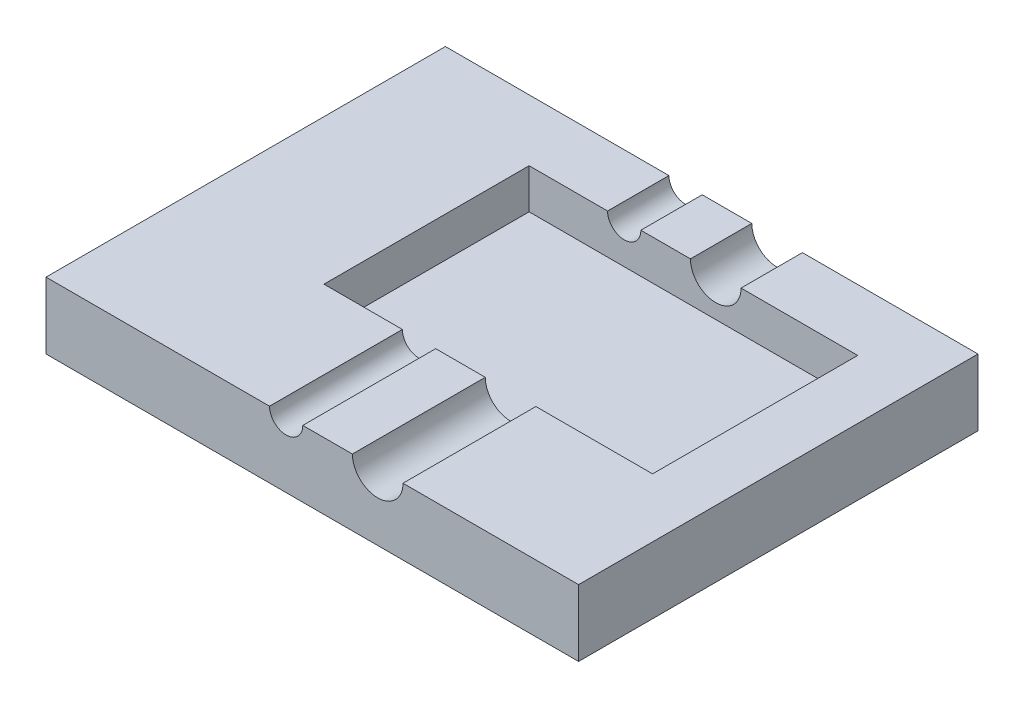
ISO-10303-21;
HEADER;
FILE_DESCRIPTION(('STEP AP214'),'2;1');
FILE_NAME('part.step','',(''),(''),'','','');
FILE_SCHEMA(('AUTOMOTIVE_DESIGN { 1 0 10303 214 1 1 1 1 }'));
ENDSEC;
DATA;
#1=APPLICATION_CONTEXT('core data for automotive mechanical design processes');
#2=APPLICATION_PROTOCOL_DEFINITION('international standard','automotive_design',2000,#1);
#3=PRODUCT_CONTEXT('',#1,'mechanical');
#4=PRODUCT('Part','Part','',(#3));
#5=PRODUCT_RELATED_PRODUCT_CATEGORY('part','',(#4));
#6=PRODUCT_DEFINITION_FORMATION('','',#4);
#7=PRODUCT_DEFINITION_CONTEXT('part definition',#1,'design');
#8=PRODUCT_DEFINITION('design','',#6,#7);
#9=PRODUCT_DEFINITION_SHAPE('','',#8);
#10=(LENGTH_UNIT() NAMED_UNIT(*) SI_UNIT(.MILLI.,.METRE.));
#11=(NAMED_UNIT(*) PLANE_ANGLE_UNIT() SI_UNIT($,.RADIAN.));
#12=(NAMED_UNIT(*) SI_UNIT($,.STERADIAN.) SOLID_ANGLE_UNIT());
#13=UNCERTAINTY_MEASURE_WITH_UNIT(LENGTH_MEASURE(1.E-05),#10,'distance_accuracy_value','');
#14=(GEOMETRIC_REPRESENTATION_CONTEXT(3) GLOBAL_UNCERTAINTY_ASSIGNED_CONTEXT((#13)) GLOBAL_UNIT_ASSIGNED_CONTEXT((#10,
#11,#12)) REPRESENTATION_CONTEXT('',''));
#15=CARTESIAN_POINT('',(0.,0.,0.));
#16=DIRECTION('',(0.,0.,1.));
#17=DIRECTION('',(1.,0.,0.));
#18=AXIS2_PLACEMENT_3D('',#15,#16,#17);
#19=CARTESIAN_POINT('',(0.,12.7,0.));
#20=DIRECTION('',(0.,-1.,0.));
#21=DIRECTION('',(0.,0.,-1.));
#22=AXIS2_PLACEMENT_3D('',#19,#20,#21);
#23=PLANE('',#22);
#24=DIRECTION('',(1.,0.,0.));
#25=VECTOR('',#24,1.);
#26=CARTESIAN_POINT('',(-23.1249939003562,12.7,-17.3143065832297));
#27=LINE('',#26,#25);
#28=CARTESIAN_POINT('',(-1.81162350851414,12.7,-17.3143065832297));
#29=VERTEX_POINT('',#28);
#30=CARTESIAN_POINT('',(7.64987649148585,12.7,-17.3143065832297));
#31=VERTEX_POINT('',#30);
#32=EDGE_CURVE('E226',#29,#31,#27,.T.);
#33=ORIENTED_EDGE('',*,*,#32,.F.);
#34=DIRECTION('',(0.,0.,1.));
#35=VECTOR('',#34,1.);
#36=CARTESIAN_POINT('',(-1.81162350851414,12.7,-68.1620253164557));
#37=LINE('',#36,#35);
#38=CARTESIAN_POINT('',(-1.81162350851414,12.7,8.03797468354433));
#39=VERTEX_POINT('',#38);
#40=EDGE_CURVE('E257',#29,#39,#37,.T.);
#41=ORIENTED_EDGE('',*,*,#40,.T.);
#42=DIRECTION('',(1.,0.,0.));
#43=VECTOR('',#42,1.);
#44=CARTESIAN_POINT('',(-50.8,12.7,8.03797468354433));
#45=LINE('',#44,#43);
#46=CARTESIAN_POINT('',(7.64987649148585,12.7,8.03797468354433));
#47=VERTEX_POINT('',#46);
#48=EDGE_CURVE('E354',#39,#47,#45,.T.);
#49=ORIENTED_EDGE('',*,*,#48,.T.);
#50=DIRECTION('',(0.,0.,1.));
#51=VECTOR('',#50,1.);
#52=CARTESIAN_POINT('',(7.64987649148585,12.7,-68.1620253164557));
#53=LINE('',#52,#51);
#54=EDGE_CURVE('E271',#47,#31,#53,.F.);
#55=ORIENTED_EDGE('',*,*,#54,.T.);
#56=EDGE_LOOP('',(#33,#41,#49,#55));
#57=FACE_BOUND('',#56,.T.);
#58=ADVANCED_FACE('F44',(#57),#23,.F.);
#59=DIRECTION('',(-1.,0.,0.));
#60=VECTOR('',#59,1.);
#61=CARTESIAN_POINT('',(-50.8,12.7,-68.1620253164557));
#62=LINE('',#61,#60);
#63=CARTESIAN_POINT('',(7.64987649148585,12.7,-68.1620253164557));
#64=VERTEX_POINT('',#63);
#65=CARTESIAN_POINT('',(-1.81162350851414,12.7,-68.1620253164557));
#66=VERTEX_POINT('',#65);
#67=EDGE_CURVE('E177',#64,#66,#62,.T.);
#68=ORIENTED_EDGE('',*,*,#67,.T.);
#69=CARTESIAN_POINT('',(-1.81162350851414,12.7,-56.452963685655));
#70=VERTEX_POINT('',#69);
#71=EDGE_CURVE('E245',#66,#70,#37,.T.);
#72=ORIENTED_EDGE('',*,*,#71,.T.);
#73=DIRECTION('',(1.,0.,0.));
#74=VECTOR('',#73,1.);
#75=CARTESIAN_POINT('',(-23.1249939003562,12.7,-56.452963685655));
#76=LINE('',#75,#74);
#77=CARTESIAN_POINT('',(7.64987649148585,12.7,-56.452963685655));
#78=VERTEX_POINT('',#77);
#79=EDGE_CURVE('E240',#70,#78,#76,.T.);
#80=ORIENTED_EDGE('',*,*,#79,.T.);
#81=EDGE_CURVE('E64',#78,#64,#53,.F.);
#82=ORIENTED_EDGE('',*,*,#81,.T.);
#83=EDGE_LOOP('',(#68,#72,#80,#82));
#84=FACE_BOUND('',#83,.T.);
#85=ADVANCED_FACE('F283',(#84),#23,.F.);
#86=CARTESIAN_POINT('',(50.8,12.7,-68.1620253164557));
#87=VERTEX_POINT('',#86);
#88=CARTESIAN_POINT('',(17.3018764914859,12.7,-68.1620253164557));
#89=VERTEX_POINT('',#88);
#90=EDGE_CURVE('E173',#87,#89,#62,.T.);
#91=ORIENTED_EDGE('',*,*,#90,.T.);
#92=DIRECTION('',(0.,0.,1.));
#93=VECTOR('',#92,1.);
#94=CARTESIAN_POINT('',(17.3018764914859,12.7,-68.1620253164557));
#95=LINE('',#94,#93);
#96=CARTESIAN_POINT('',(17.3018764914859,12.7,-56.452963685655));
#97=VERTEX_POINT('',#96);
#98=EDGE_CURVE('E160',#89,#97,#95,.T.);
#99=ORIENTED_EDGE('',*,*,#98,.T.);
#100=CARTESIAN_POINT('',(39.5600692919533,12.7,-56.452963685655));
#101=VERTEX_POINT('',#100);
#102=EDGE_CURVE('E236',#97,#101,#76,.T.);
#103=ORIENTED_EDGE('',*,*,#102,.T.);
#104=DIRECTION('',(0.,0.,-1.));
#105=VECTOR('',#104,1.);
#106=CARTESIAN_POINT('',(39.5600692919533,12.7,-17.3143065832297));
#107=LINE('',#106,#105);
#108=CARTESIAN_POINT('',(39.5600692919533,12.7,-17.3143065832297));
#109=VERTEX_POINT('',#108);
#110=EDGE_CURVE('E228',#109,#101,#107,.T.);
#111=ORIENTED_EDGE('',*,*,#110,.F.);
#112=CARTESIAN_POINT('',(17.3018764914859,12.7,-17.3143065832297));
#113=VERTEX_POINT('',#112);
#114=EDGE_CURVE('E230',#113,#109,#27,.T.);
#115=ORIENTED_EDGE('',*,*,#114,.F.);
#116=CARTESIAN_POINT('',(17.3018764914859,12.7,8.03797468354433));
#117=VERTEX_POINT('',#116);
#118=EDGE_CURVE('E169',#113,#117,#95,.T.);
#119=ORIENTED_EDGE('',*,*,#118,.T.);
#120=CARTESIAN_POINT('',(50.8,12.7,8.03797468354433));
#121=VERTEX_POINT('',#120);
#122=EDGE_CURVE('E195',#117,#121,#45,.T.);
#123=ORIENTED_EDGE('',*,*,#122,.T.);
#124=DIRECTION('',(0.,0.,-1.));
#125=VECTOR('',#124,1.);
#126=CARTESIAN_POINT('',(50.8,12.7,8.03797468354433));
#127=LINE('',#126,#125);
#128=EDGE_CURVE('E184',#121,#87,#127,.T.);
#129=ORIENTED_EDGE('',*,*,#128,.T.);
#130=EDGE_LOOP('',(#91,#99,#103,#111,#115,#119,#123,#129));
#131=FACE_BOUND('',#130,.T.);
#132=ADVANCED_FACE('F185',(#131),#23,.F.);
#133=CARTESIAN_POINT('',(-50.8,12.7,8.03797468354433));
#134=DIRECTION('',(0.,0.,-1.));
#135=DIRECTION('',(-1.,0.,0.));
#136=AXIS2_PLACEMENT_3D('',#133,#134,#135);
#137=PLANE('',#136);
#138=CARTESIAN_POINT('',(-4.98662350851414,12.7,8.03797468354433));
#139=DIRECTION('',(0.,0.,1.));
#140=DIRECTION('',(1.,0.,0.));
#141=AXIS2_PLACEMENT_3D('',#138,#139,#140);
#142=CIRCLE('',#141,3.175);
#143=CARTESIAN_POINT('',(-8.16162350851414,12.7,8.03797468354433));
#144=VERTEX_POINT('',#143);
#145=EDGE_CURVE('E279',#144,#39,#142,.T.);
#146=ORIENTED_EDGE('',*,*,#145,.F.);
#147=CARTESIAN_POINT('',(-50.8,12.7,8.03797468354433));
#148=VERTEX_POINT('',#147);
#149=EDGE_CURVE('E314',#148,#144,#45,.T.);
#150=ORIENTED_EDGE('',*,*,#149,.F.);
#151=DIRECTION('',(0.,-1.,0.));
#152=VECTOR('',#151,1.);
#153=CARTESIAN_POINT('',(-50.8,12.7,8.03797468354433));
#154=LINE('',#153,#152);
#155=CARTESIAN_POINT('',(-50.8,0.,8.03797468354433));
#156=VERTEX_POINT('',#155);
#157=EDGE_CURVE('E311',#148,#156,#154,.T.);
#158=ORIENTED_EDGE('',*,*,#157,.T.);
#159=DIRECTION('',(1.,0.,0.));
#160=VECTOR('',#159,1.);
#161=CARTESIAN_POINT('',(-50.8,0.,8.03797468354433));
#162=LINE('',#161,#160);
#163=CARTESIAN_POINT('',(50.8,0.,8.03797468354433));
#164=VERTEX_POINT('',#163);
#165=EDGE_CURVE('E200',#156,#164,#162,.T.);
#166=ORIENTED_EDGE('',*,*,#165,.T.);
#167=DIRECTION('',(0.,-1.,0.));
#168=VECTOR('',#167,1.);
#169=CARTESIAN_POINT('',(50.8,12.7,8.03797468354433));
#170=LINE('',#169,#168);
#171=EDGE_CURVE('E310',#121,#164,#170,.T.);
#172=ORIENTED_EDGE('',*,*,#171,.F.);
#173=ORIENTED_EDGE('',*,*,#122,.F.);
#174=CARTESIAN_POINT('',(12.4758764914859,12.7,8.03797468354433));
#175=DIRECTION('',(0.,0.,1.));
#176=DIRECTION('',(1.,0.,0.));
#177=AXIS2_PLACEMENT_3D('',#174,#175,#176);
#178=CIRCLE('',#177,4.826);
#179=EDGE_CURVE('E179',#47,#117,#178,.T.);
#180=ORIENTED_EDGE('',*,*,#179,.F.);
#181=ORIENTED_EDGE('',*,*,#48,.F.);
#182=EDGE_LOOP('',(#146,#150,#158,#166,#172,#173,#180,#181));
#183=FACE_BOUND('',#182,.T.);
#184=ADVANCED_FACE('F356',(#183),#137,.F.);
#185=ORIENTED_EDGE('',*,*,#149,.T.);
#186=DIRECTION('',(0.,0.,1.));
#187=VECTOR('',#186,1.);
#188=CARTESIAN_POINT('',(-8.16162350851414,12.7,-68.1620253164557));
#189=LINE('',#188,#187);
#190=CARTESIAN_POINT('',(-8.16162350851414,12.7,-17.3143065832297));
#191=VERTEX_POINT('',#190);
#192=EDGE_CURVE('E167',#144,#191,#189,.F.);
#193=ORIENTED_EDGE('',*,*,#192,.T.);
#194=CARTESIAN_POINT('',(-23.1249939003562,12.7,-17.3143065832297));
#195=VERTEX_POINT('',#194);
#196=EDGE_CURVE('E225',#195,#191,#27,.T.);
#197=ORIENTED_EDGE('',*,*,#196,.F.);
#198=DIRECTION('',(0.,0.,-1.));
#199=VECTOR('',#198,1.);
#200=CARTESIAN_POINT('',(-23.1249939003562,12.7,-17.3143065832297));
#201=LINE('',#200,#199);
#202=CARTESIAN_POINT('',(-23.1249939003562,12.7,-56.452963685655));
#203=VERTEX_POINT('',#202);
#204=EDGE_CURVE('E239',#195,#203,#201,.T.);
#205=ORIENTED_EDGE('',*,*,#204,.T.);
#206=CARTESIAN_POINT('',(-8.16162350851414,12.7,-56.452963685655));
#207=VERTEX_POINT('',#206);
#208=EDGE_CURVE('E232',#203,#207,#76,.T.);
#209=ORIENTED_EDGE('',*,*,#208,.T.);
#210=CARTESIAN_POINT('',(-8.16162350851414,12.7,-68.1620253164557));
#211=VERTEX_POINT('',#210);
#212=EDGE_CURVE('E68',#207,#211,#189,.F.);
#213=ORIENTED_EDGE('',*,*,#212,.T.);
#214=CARTESIAN_POINT('',(-50.8,12.7,-68.1620253164557));
#215=VERTEX_POINT('',#214);
#216=EDGE_CURVE('E188',#211,#215,#62,.T.);
#217=ORIENTED_EDGE('',*,*,#216,.T.);
#218=DIRECTION('',(0.,0.,1.));
#219=VECTOR('',#218,1.);
#220=CARTESIAN_POINT('',(-50.8,12.7,8.03797468354433));
#221=LINE('',#220,#219);
#222=EDGE_CURVE('E186',#215,#148,#221,.T.);
#223=ORIENTED_EDGE('',*,*,#222,.T.);
#224=EDGE_LOOP('',(#185,#193,#197,#205,#209,#213,#217,#223));
#225=FACE_BOUND('',#224,.T.);
#226=ADVANCED_FACE('F347',(#225),#23,.F.);
#227=CARTESIAN_POINT('',(50.8,12.7,8.03797468354433));
#228=DIRECTION('',(-1.,0.,0.));
#229=DIRECTION('',(0.,0.,1.));
#230=AXIS2_PLACEMENT_3D('',#227,#228,#229);
#231=PLANE('',#230);
#232=DIRECTION('',(0.,0.,-1.));
#233=VECTOR('',#232,1.);
#234=CARTESIAN_POINT('',(50.8,0.,8.03797468354433));
#235=LINE('',#234,#233);
#236=CARTESIAN_POINT('',(50.8,0.,-68.1620253164557));
#237=VERTEX_POINT('',#236);
#238=EDGE_CURVE('E208',#164,#237,#235,.T.);
#239=ORIENTED_EDGE('',*,*,#238,.T.);
#240=DIRECTION('',(0.,-1.,0.));
#241=VECTOR('',#240,1.);
#242=CARTESIAN_POINT('',(50.8,12.7,-68.1620253164557));
#243=LINE('',#242,#241);
#244=EDGE_CURVE('E319',#87,#237,#243,.T.);
#245=ORIENTED_EDGE('',*,*,#244,.F.);
#246=ORIENTED_EDGE('',*,*,#128,.F.);
#247=ORIENTED_EDGE('',*,*,#171,.T.);
#248=EDGE_LOOP('',(#239,#245,#246,#247));
#249=FACE_BOUND('',#248,.T.);
#250=ADVANCED_FACE('F50',(#249),#231,.F.);
#251=CARTESIAN_POINT('',(-50.8,12.7,-68.1620253164557));
#252=DIRECTION('',(0.,0.,1.));
#253=DIRECTION('',(1.,0.,0.));
#254=AXIS2_PLACEMENT_3D('',#251,#252,#253);
#255=PLANE('',#254);
#256=ORIENTED_EDGE('',*,*,#216,.F.);
#257=CARTESIAN_POINT('',(-4.98662350851414,12.7,-68.1620253164557));
#258=DIRECTION('',(0.,0.,1.));
#259=DIRECTION('',(1.,0.,0.));
#260=AXIS2_PLACEMENT_3D('',#257,#258,#259);
#261=CIRCLE('',#260,3.175);
#262=EDGE_CURVE('E273',#211,#66,#261,.T.);
#263=ORIENTED_EDGE('',*,*,#262,.T.);
#264=ORIENTED_EDGE('',*,*,#67,.F.);
#265=CARTESIAN_POINT('',(12.4758764914859,12.7,-68.1620253164557));
#266=DIRECTION('',(0.,0.,1.));
#267=DIRECTION('',(1.,0.,0.));
#268=AXIS2_PLACEMENT_3D('',#265,#266,#267);
#269=CIRCLE('',#268,4.826);
#270=EDGE_CURVE('E159',#64,#89,#269,.T.);
#271=ORIENTED_EDGE('',*,*,#270,.T.);
#272=ORIENTED_EDGE('',*,*,#90,.F.);
#273=ORIENTED_EDGE('',*,*,#244,.T.);
#274=DIRECTION('',(-1.,0.,0.));
#275=VECTOR('',#274,1.);
#276=CARTESIAN_POINT('',(-50.8,0.,-68.1620253164557));
#277=LINE('',#276,#275);
#278=CARTESIAN_POINT('',(-50.8,0.,-68.1620253164557));
#279=VERTEX_POINT('',#278);
#280=EDGE_CURVE('E300',#237,#279,#277,.T.);
#281=ORIENTED_EDGE('',*,*,#280,.T.);
#282=DIRECTION('',(0.,-1.,0.));
#283=VECTOR('',#282,1.);
#284=CARTESIAN_POINT('',(-50.8,12.7,-68.1620253164557));
#285=LINE('',#284,#283);
#286=EDGE_CURVE('E320',#215,#279,#285,.T.);
#287=ORIENTED_EDGE('',*,*,#286,.F.);
#288=EDGE_LOOP('',(#256,#263,#264,#271,#272,#273,#281,#287));
#289=FACE_BOUND('',#288,.T.);
#290=ADVANCED_FACE('F171',(#289),#255,.F.);
#291=CARTESIAN_POINT('',(-50.8,12.7,8.03797468354433));
#292=DIRECTION('',(1.,0.,0.));
#293=DIRECTION('',(0.,0.,-1.));
#294=AXIS2_PLACEMENT_3D('',#291,#292,#293);
#295=PLANE('',#294);
#296=DIRECTION('',(0.,0.,1.));
#297=VECTOR('',#296,1.);
#298=CARTESIAN_POINT('',(-50.8,0.,8.03797468354433));
#299=LINE('',#298,#297);
#300=EDGE_CURVE('E203',#279,#156,#299,.T.);
#301=ORIENTED_EDGE('',*,*,#300,.T.);
#302=ORIENTED_EDGE('',*,*,#157,.F.);
#303=ORIENTED_EDGE('',*,*,#222,.F.);
#304=ORIENTED_EDGE('',*,*,#286,.T.);
#305=EDGE_LOOP('',(#301,#302,#303,#304));
#306=FACE_BOUND('',#305,.T.);
#307=ADVANCED_FACE('F453',(#306),#295,.F.);
#308=CARTESIAN_POINT('',(0.,0.,0.));
#309=DIRECTION('',(0.,-1.,0.));
#310=DIRECTION('',(0.,0.,-1.));
#311=AXIS2_PLACEMENT_3D('',#308,#309,#310);
#312=PLANE('',#311);
#313=ORIENTED_EDGE('',*,*,#238,.F.);
#314=ORIENTED_EDGE('',*,*,#165,.F.);
#315=ORIENTED_EDGE('',*,*,#300,.F.);
#316=ORIENTED_EDGE('',*,*,#280,.F.);
#317=EDGE_LOOP('',(#313,#314,#315,#316));
#318=FACE_BOUND('',#317,.T.);
#319=ADVANCED_FACE('F445',(#318),#312,.T.);
#320=CARTESIAN_POINT('',(-23.1249939003562,5.08,-17.3143065832297));
#321=DIRECTION('',(1.,0.,0.));
#322=DIRECTION('',(0.,0.,-1.));
#323=AXIS2_PLACEMENT_3D('',#320,#321,#322);
#324=PLANE('',#323);
#325=ORIENTED_EDGE('',*,*,#204,.F.);
#326=DIRECTION('',(0.,1.,0.));
#327=VECTOR('',#326,1.);
#328=CARTESIAN_POINT('',(-23.1249939003562,5.08,-17.3143065832297));
#329=LINE('',#328,#327);
#330=CARTESIAN_POINT('',(-23.1249939003562,5.08,-17.3143065832297));
#331=VERTEX_POINT('',#330);
#332=EDGE_CURVE('E220',#331,#195,#329,.T.);
#333=ORIENTED_EDGE('',*,*,#332,.F.);
#334=DIRECTION('',(0.,0.,-1.));
#335=VECTOR('',#334,1.);
#336=CARTESIAN_POINT('',(-23.1249939003562,5.08,-17.3143065832297));
#337=LINE('',#336,#335);
#338=CARTESIAN_POINT('',(-23.1249939003562,5.08,-56.452963685655));
#339=VERTEX_POINT('',#338);
#340=EDGE_CURVE('E229',#331,#339,#337,.T.);
#341=ORIENTED_EDGE('',*,*,#340,.T.);
#342=DIRECTION('',(0.,1.,0.));
#343=VECTOR('',#342,1.);
#344=CARTESIAN_POINT('',(-23.1249939003562,5.08,-56.452963685655));
#345=LINE('',#344,#343);
#346=EDGE_CURVE('E204',#339,#203,#345,.T.);
#347=ORIENTED_EDGE('',*,*,#346,.T.);
#348=EDGE_LOOP('',(#325,#333,#341,#347));
#349=FACE_BOUND('',#348,.T.);
#350=ADVANCED_FACE('F345',(#349),#324,.T.);
#351=CARTESIAN_POINT('',(-23.1249939003562,5.08,-56.452963685655));
#352=DIRECTION('',(0.,0.,1.));
#353=DIRECTION('',(1.,0.,0.));
#354=AXIS2_PLACEMENT_3D('',#351,#352,#353);
#355=PLANE('',#354);
#356=CARTESIAN_POINT('',(-4.98662350851414,12.7,-56.452963685655));
#357=DIRECTION('',(0.,0.,1.));
#358=DIRECTION('',(1.,0.,0.));
#359=AXIS2_PLACEMENT_3D('',#356,#357,#358);
#360=CIRCLE('',#359,3.175);
#361=EDGE_CURVE('E260',#207,#70,#360,.T.);
#362=ORIENTED_EDGE('',*,*,#361,.F.);
#363=ORIENTED_EDGE('',*,*,#208,.F.);
#364=ORIENTED_EDGE('',*,*,#346,.F.);
#365=DIRECTION('',(1.,0.,0.));
#366=VECTOR('',#365,1.);
#367=CARTESIAN_POINT('',(-23.1249939003562,5.08,-56.452963685655));
#368=LINE('',#367,#366);
#369=CARTESIAN_POINT('',(39.5600692919533,5.08,-56.452963685655));
#370=VERTEX_POINT('',#369);
#371=EDGE_CURVE('E253',#339,#370,#368,.T.);
#372=ORIENTED_EDGE('',*,*,#371,.T.);
#373=DIRECTION('',(0.,1.,0.));
#374=VECTOR('',#373,1.);
#375=CARTESIAN_POINT('',(39.5600692919533,5.08,-56.452963685655));
#376=LINE('',#375,#374);
#377=EDGE_CURVE('E207',#370,#101,#376,.T.);
#378=ORIENTED_EDGE('',*,*,#377,.T.);
#379=ORIENTED_EDGE('',*,*,#102,.F.);
#380=CARTESIAN_POINT('',(12.4758764914859,12.7,-56.452963685655));
#381=DIRECTION('',(0.,0.,1.));
#382=DIRECTION('',(1.,0.,0.));
#383=AXIS2_PLACEMENT_3D('',#380,#381,#382);
#384=CIRCLE('',#383,4.826);
#385=EDGE_CURVE('E161',#78,#97,#384,.T.);
#386=ORIENTED_EDGE('',*,*,#385,.F.);
#387=ORIENTED_EDGE('',*,*,#79,.F.);
#388=EDGE_LOOP('',(#362,#363,#364,#372,#378,#379,#386,#387));
#389=FACE_BOUND('',#388,.T.);
#390=ADVANCED_FACE('F343',(#389),#355,.T.);
#391=CARTESIAN_POINT('',(39.5600692919533,5.08,-17.3143065832297));
#392=DIRECTION('',(1.,0.,0.));
#393=DIRECTION('',(0.,0.,-1.));
#394=AXIS2_PLACEMENT_3D('',#391,#392,#393);
#395=PLANE('',#394);
#396=ORIENTED_EDGE('',*,*,#110,.T.);
#397=ORIENTED_EDGE('',*,*,#377,.F.);
#398=DIRECTION('',(0.,0.,-1.));
#399=VECTOR('',#398,1.);
#400=CARTESIAN_POINT('',(39.5600692919533,5.08,-17.3143065832297));
#401=LINE('',#400,#399);
#402=CARTESIAN_POINT('',(39.5600692919533,5.08,-17.3143065832297));
#403=VERTEX_POINT('',#402);
#404=EDGE_CURVE('E250',#403,#370,#401,.T.);
#405=ORIENTED_EDGE('',*,*,#404,.F.);
#406=DIRECTION('',(0.,1.,0.));
#407=VECTOR('',#406,1.);
#408=CARTESIAN_POINT('',(39.5600692919533,5.08,-17.3143065832297));
#409=LINE('',#408,#407);
#410=EDGE_CURVE('E213',#403,#109,#409,.T.);
#411=ORIENTED_EDGE('',*,*,#410,.T.);
#412=EDGE_LOOP('',(#396,#397,#405,#411));
#413=FACE_BOUND('',#412,.T.);
#414=ADVANCED_FACE('F334',(#413),#395,.F.);
#415=CARTESIAN_POINT('',(-23.1249939003562,5.08,-17.3143065832297));
#416=DIRECTION('',(0.,0.,1.));
#417=DIRECTION('',(1.,0.,0.));
#418=AXIS2_PLACEMENT_3D('',#415,#416,#417);
#419=PLANE('',#418);
#420=ORIENTED_EDGE('',*,*,#196,.T.);
#421=CARTESIAN_POINT('',(-4.98662350851414,12.7,-17.3143065832297));
#422=DIRECTION('',(0.,0.,1.));
#423=DIRECTION('',(1.,0.,0.));
#424=AXIS2_PLACEMENT_3D('',#421,#422,#423);
#425=CIRCLE('',#424,3.175);
#426=EDGE_CURVE('E11',#191,#29,#425,.T.);
#427=ORIENTED_EDGE('',*,*,#426,.T.);
#428=ORIENTED_EDGE('',*,*,#32,.T.);
#429=CARTESIAN_POINT('',(12.4758764914859,12.7,-17.3143065832297));
#430=DIRECTION('',(0.,0.,1.));
#431=DIRECTION('',(1.,0.,0.));
#432=AXIS2_PLACEMENT_3D('',#429,#430,#431);
#433=CIRCLE('',#432,4.826);
#434=EDGE_CURVE('E53',#31,#113,#433,.T.);
#435=ORIENTED_EDGE('',*,*,#434,.T.);
#436=ORIENTED_EDGE('',*,*,#114,.T.);
#437=ORIENTED_EDGE('',*,*,#410,.F.);
#438=DIRECTION('',(1.,0.,0.));
#439=VECTOR('',#438,1.);
#440=CARTESIAN_POINT('',(-23.1249939003562,5.08,-17.3143065832297));
#441=LINE('',#440,#439);
#442=EDGE_CURVE('E222',#331,#403,#441,.T.);
#443=ORIENTED_EDGE('',*,*,#442,.F.);
#444=ORIENTED_EDGE('',*,*,#332,.T.);
#445=EDGE_LOOP('',(#420,#427,#428,#435,#436,#437,#443,#444));
#446=FACE_BOUND('',#445,.T.);
#447=ADVANCED_FACE('F326',(#446),#419,.F.);
#448=CARTESIAN_POINT('',(0.,5.08,0.));
#449=DIRECTION('',(0.,-1.,0.));
#450=DIRECTION('',(0.,0.,-1.));
#451=AXIS2_PLACEMENT_3D('',#448,#449,#450);
#452=PLANE('',#451);
#453=ORIENTED_EDGE('',*,*,#340,.F.);
#454=ORIENTED_EDGE('',*,*,#442,.T.);
#455=ORIENTED_EDGE('',*,*,#404,.T.);
#456=ORIENTED_EDGE('',*,*,#371,.F.);
#457=EDGE_LOOP('',(#453,#454,#455,#456));
#458=FACE_BOUND('',#457,.T.);
#459=ADVANCED_FACE('F338',(#458),#452,.F.);
#460=CARTESIAN_POINT('',(12.4758764914859,12.7,-68.1620253164557));
#461=DIRECTION('',(0.,0.,1.));
#462=DIRECTION('',(1.,0.,0.));
#463=AXIS2_PLACEMENT_3D('',#460,#461,#462);
#464=CYLINDRICAL_SURFACE('',#463,4.826);
#465=ORIENTED_EDGE('',*,*,#434,.F.);
#466=ORIENTED_EDGE('',*,*,#54,.F.);
#467=ORIENTED_EDGE('',*,*,#179,.T.);
#468=ORIENTED_EDGE('',*,*,#118,.F.);
#469=EDGE_LOOP('',(#465,#466,#467,#468));
#470=FACE_BOUND('',#469,.T.);
#471=ADVANCED_FACE('F355',(#470),#464,.F.);
#472=CARTESIAN_POINT('',(-4.98662350851414,12.7,-68.1620253164557));
#473=DIRECTION('',(0.,0.,1.));
#474=DIRECTION('',(1.,0.,0.));
#475=AXIS2_PLACEMENT_3D('',#472,#473,#474);
#476=CYLINDRICAL_SURFACE('',#475,3.175);
#477=ORIENTED_EDGE('',*,*,#426,.F.);
#478=ORIENTED_EDGE('',*,*,#192,.F.);
#479=ORIENTED_EDGE('',*,*,#145,.T.);
#480=ORIENTED_EDGE('',*,*,#40,.F.);
#481=EDGE_LOOP('',(#477,#478,#479,#480));
#482=FACE_BOUND('',#481,.T.);
#483=ADVANCED_FACE('F364',(#482),#476,.F.);
#484=ORIENTED_EDGE('',*,*,#270,.F.);
#485=ORIENTED_EDGE('',*,*,#81,.F.);
#486=ORIENTED_EDGE('',*,*,#385,.T.);
#487=ORIENTED_EDGE('',*,*,#98,.F.);
#488=EDGE_LOOP('',(#484,#485,#486,#487));
#489=FACE_BOUND('',#488,.T.);
#490=ADVANCED_FACE('F157',(#489),#464,.F.);
#491=ORIENTED_EDGE('',*,*,#262,.F.);
#492=ORIENTED_EDGE('',*,*,#212,.F.);
#493=ORIENTED_EDGE('',*,*,#361,.T.);
#494=ORIENTED_EDGE('',*,*,#71,.F.);
#495=EDGE_LOOP('',(#491,#492,#493,#494));
#496=FACE_BOUND('',#495,.T.);
#497=ADVANCED_FACE('F366',(#496),#476,.F.);
#498=CLOSED_SHELL('',(#58,#85,#132,#184,#226,#250,#290,#307,#319,#350,#390,#414,#447,#459,#471,
#483,#490,#497));
#499=MANIFOLD_SOLID_BREP('B2',#498);
#500=ADVANCED_BREP_SHAPE_REPRESENTATION('',(#18,#499),#14);
#501=SHAPE_DEFINITION_REPRESENTATION(#9,#500);
ENDSEC;
END-ISO-10303-21;
